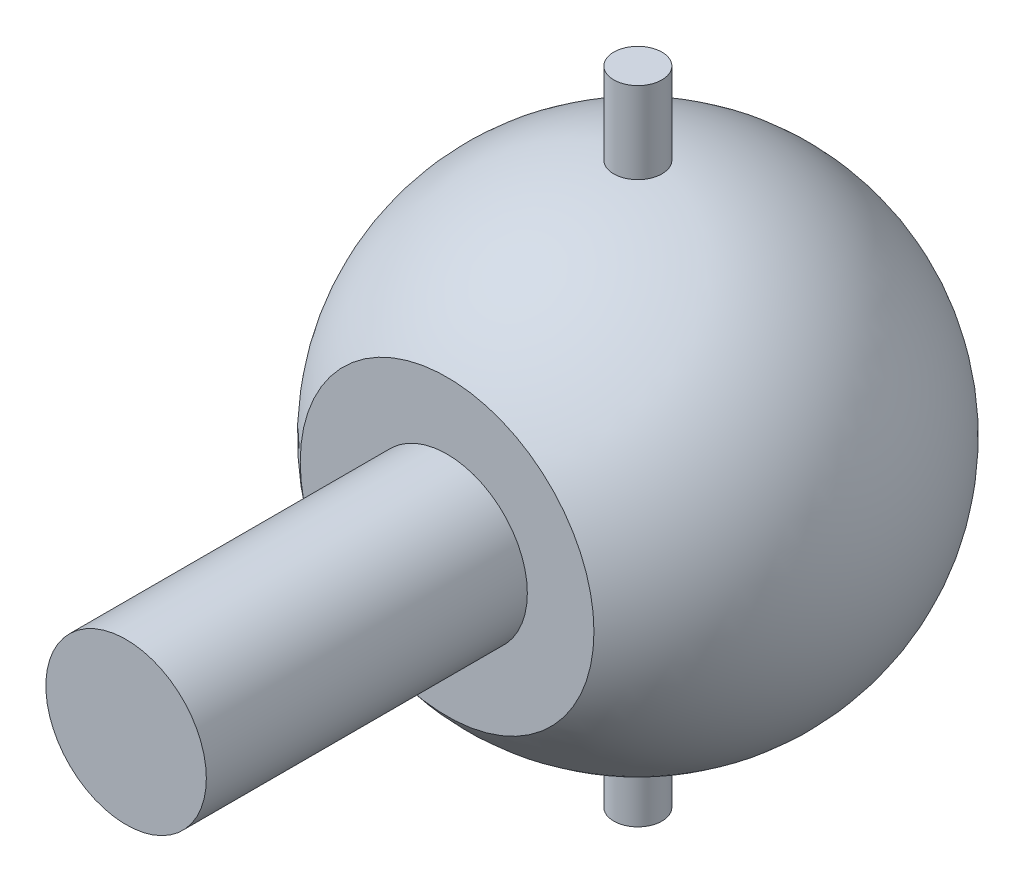
ISO-10303-21;
HEADER;
FILE_DESCRIPTION(('STEP AP214'),'2;1');
FILE_NAME('part.step','',(''),(''),'','','');
FILE_SCHEMA(('AUTOMOTIVE_DESIGN { 1 0 10303 214 1 1 1 1 }'));
ENDSEC;
DATA;
#1=APPLICATION_CONTEXT('core data for automotive mechanical design processes');
#2=APPLICATION_PROTOCOL_DEFINITION('international standard','automotive_design',2000,#1);
#3=PRODUCT_CONTEXT('',#1,'mechanical');
#4=PRODUCT('Part','Part','',(#3));
#5=PRODUCT_RELATED_PRODUCT_CATEGORY('part','',(#4));
#6=PRODUCT_DEFINITION_FORMATION('','',#4);
#7=PRODUCT_DEFINITION_CONTEXT('part definition',#1,'design');
#8=PRODUCT_DEFINITION('design','',#6,#7);
#9=PRODUCT_DEFINITION_SHAPE('','',#8);
#10=(LENGTH_UNIT() NAMED_UNIT(*) SI_UNIT(.MILLI.,.METRE.));
#11=(NAMED_UNIT(*) PLANE_ANGLE_UNIT() SI_UNIT($,.RADIAN.));
#12=(NAMED_UNIT(*) SI_UNIT($,.STERADIAN.) SOLID_ANGLE_UNIT());
#13=UNCERTAINTY_MEASURE_WITH_UNIT(LENGTH_MEASURE(1.E-05),#10,'distance_accuracy_value','');
#14=(GEOMETRIC_REPRESENTATION_CONTEXT(3) GLOBAL_UNCERTAINTY_ASSIGNED_CONTEXT((#13)) GLOBAL_UNIT_ASSIGNED_CONTEXT((#10,
#11,#12)) REPRESENTATION_CONTEXT('',''));
#15=CARTESIAN_POINT('',(0.,0.,0.));
#16=DIRECTION('',(0.,0.,1.));
#17=DIRECTION('',(1.,0.,0.));
#18=AXIS2_PLACEMENT_3D('',#15,#16,#17);
#19=CARTESIAN_POINT('',(15.,-9.1508281461021,11.8853836387601));
#20=DIRECTION('',(0.,0.,1.));
#21=DIRECTION('',(1.,0.,0.));
#22=AXIS2_PLACEMENT_3D('',#19,#20,#21);
#23=PLANE('',#22);
#24=CARTESIAN_POINT('',(0.,0.,11.8853836387601));
#25=DIRECTION('',(0.,0.,1.));
#26=DIRECTION('',(1.,0.,0.));
#27=AXIS2_PLACEMENT_3D('',#24,#25,#26);
#28=CIRCLE('',#27,9.15082814610209);
#29=CARTESIAN_POINT('',(9.15082814610209,0.,11.8853836387601));
#30=VERTEX_POINT('',#29);
#31=EDGE_CURVE('E10',#30,#30,#28,.T.);
#32=ORIENTED_EDGE('',*,*,#31,.T.);
#33=EDGE_LOOP('',(#32));
#34=FACE_BOUND('',#33,.T.);
#35=CARTESIAN_POINT('',(0.,0.,11.8853836387601));
#36=DIRECTION('',(0.,0.,1.));
#37=DIRECTION('',(1.,0.,0.));
#38=AXIS2_PLACEMENT_3D('',#35,#36,#37);
#39=CIRCLE('',#38,5.);
#40=CARTESIAN_POINT('',(5.,0.,11.8853836387601));
#41=VERTEX_POINT('',#40);
#42=EDGE_CURVE('E58',#41,#41,#39,.T.);
#43=ORIENTED_EDGE('',*,*,#42,.F.);
#44=EDGE_LOOP('',(#43));
#45=FACE_BOUND('',#44,.T.);
#46=ADVANCED_FACE('F30',(#34,#45),#23,.T.);
#47=CARTESIAN_POINT('',(0.,0.,0.));
#48=DIRECTION('',(0.,1.,0.));
#49=DIRECTION('',(1.,0.,0.));
#50=AXIS2_PLACEMENT_3D('',#47,#48,#49);
#51=SPHERICAL_SURFACE('',#50,15.);
#52=CARTESIAN_POINT('',(0.,14.9248115565993,0.));
#53=DIRECTION('',(0.,-1.,0.));
#54=DIRECTION('',(0.,0.,-1.));
#55=AXIS2_PLACEMENT_3D('',#52,#53,#54);
#56=CIRCLE('',#55,1.5);
#57=CARTESIAN_POINT('',(0.,14.9248115565993,-1.5));
#58=VERTEX_POINT('',#57);
#59=EDGE_CURVE('E34',#58,#58,#56,.T.);
#60=ORIENTED_EDGE('',*,*,#59,.T.);
#61=EDGE_LOOP('',(#60));
#62=FACE_BOUND('',#61,.T.);
#63=CARTESIAN_POINT('',(0.,-14.9248115565993,0.));
#64=DIRECTION('',(0.,1.,0.));
#65=DIRECTION('',(0.,0.,1.));
#66=AXIS2_PLACEMENT_3D('',#63,#64,#65);
#67=CIRCLE('',#66,1.5);
#68=CARTESIAN_POINT('',(0.,-14.9248115565993,1.5));
#69=VERTEX_POINT('',#68);
#70=EDGE_CURVE('E42',#69,#69,#67,.T.);
#71=ORIENTED_EDGE('',*,*,#70,.T.);
#72=EDGE_LOOP('',(#71));
#73=FACE_BOUND('',#72,.T.);
#74=ORIENTED_EDGE('',*,*,#31,.F.);
#75=EDGE_LOOP('',(#74));
#76=FACE_BOUND('',#75,.T.);
#77=ADVANCED_FACE('F32',(#62,#73,#76),#51,.T.);
#78=CARTESIAN_POINT('',(0.,-20.,0.));
#79=DIRECTION('',(0.,1.,0.));
#80=DIRECTION('',(0.,0.,1.));
#81=AXIS2_PLACEMENT_3D('',#78,#79,#80);
#82=PLANE('',#81);
#83=CARTESIAN_POINT('',(0.,-20.,0.));
#84=DIRECTION('',(0.,1.,0.));
#85=DIRECTION('',(0.,0.,1.));
#86=AXIS2_PLACEMENT_3D('',#83,#84,#85);
#87=CIRCLE('',#86,1.5);
#88=CARTESIAN_POINT('',(0.,-20.,1.5));
#89=VERTEX_POINT('',#88);
#90=EDGE_CURVE('E44',#89,#89,#87,.T.);
#91=ORIENTED_EDGE('',*,*,#90,.F.);
#92=EDGE_LOOP('',(#91));
#93=FACE_BOUND('',#92,.T.);
#94=ADVANCED_FACE('F70',(#93),#82,.F.);
#95=CARTESIAN_POINT('',(0.,-20.,0.));
#96=DIRECTION('',(0.,1.,0.));
#97=DIRECTION('',(0.,0.,1.));
#98=AXIS2_PLACEMENT_3D('',#95,#96,#97);
#99=CYLINDRICAL_SURFACE('',#98,1.5);
#100=ORIENTED_EDGE('',*,*,#90,.T.);
#101=EDGE_LOOP('',(#100));
#102=FACE_BOUND('',#101,.T.);
#103=ORIENTED_EDGE('',*,*,#70,.F.);
#104=EDGE_LOOP('',(#103));
#105=FACE_BOUND('',#104,.T.);
#106=ADVANCED_FACE('F77',(#102,#105),#99,.T.);
#107=CARTESIAN_POINT('',(0.,20.,0.));
#108=DIRECTION('',(0.,1.,0.));
#109=DIRECTION('',(0.,0.,1.));
#110=AXIS2_PLACEMENT_3D('',#107,#108,#109);
#111=CIRCLE('',#110,1.5);
#112=CARTESIAN_POINT('',(0.,20.,1.5));
#113=VERTEX_POINT('',#112);
#114=EDGE_CURVE('E50',#113,#113,#111,.T.);
#115=ORIENTED_EDGE('',*,*,#114,.F.);
#116=EDGE_LOOP('',(#115));
#117=FACE_BOUND('',#116,.T.);
#118=ORIENTED_EDGE('',*,*,#59,.F.);
#119=EDGE_LOOP('',(#118));
#120=FACE_BOUND('',#119,.T.);
#121=ADVANCED_FACE('F73',(#117,#120),#99,.T.);
#122=CARTESIAN_POINT('',(0.,20.,0.));
#123=DIRECTION('',(0.,1.,0.));
#124=DIRECTION('',(0.,0.,1.));
#125=AXIS2_PLACEMENT_3D('',#122,#123,#124);
#126=PLANE('',#125);
#127=ORIENTED_EDGE('',*,*,#114,.T.);
#128=EDGE_LOOP('',(#127));
#129=FACE_BOUND('',#128,.T.);
#130=ADVANCED_FACE('F76',(#129),#126,.T.);
#131=CARTESIAN_POINT('',(0.,0.,31.8853836387601));
#132=DIRECTION('',(0.,0.,-1.));
#133=DIRECTION('',(-1.,0.,0.));
#134=AXIS2_PLACEMENT_3D('',#131,#132,#133);
#135=CYLINDRICAL_SURFACE('',#134,5.);
#136=CARTESIAN_POINT('',(0.,0.,31.8853836387601));
#137=DIRECTION('',(0.,0.,1.));
#138=DIRECTION('',(1.,0.,0.));
#139=AXIS2_PLACEMENT_3D('',#136,#137,#138);
#140=CIRCLE('',#139,5.);
#141=CARTESIAN_POINT('',(5.,0.,31.8853836387601));
#142=VERTEX_POINT('',#141);
#143=EDGE_CURVE('E54',#142,#142,#140,.T.);
#144=ORIENTED_EDGE('',*,*,#143,.F.);
#145=EDGE_LOOP('',(#144));
#146=FACE_BOUND('',#145,.T.);
#147=ORIENTED_EDGE('',*,*,#42,.T.);
#148=EDGE_LOOP('',(#147));
#149=FACE_BOUND('',#148,.T.);
#150=ADVANCED_FACE('F64',(#146,#149),#135,.T.);
#151=CARTESIAN_POINT('',(0.,0.,31.8853836387601));
#152=DIRECTION('',(0.,0.,1.));
#153=DIRECTION('',(1.,0.,0.));
#154=AXIS2_PLACEMENT_3D('',#151,#152,#153);
#155=PLANE('',#154);
#156=ORIENTED_EDGE('',*,*,#143,.T.);
#157=EDGE_LOOP('',(#156));
#158=FACE_BOUND('',#157,.T.);
#159=ADVANCED_FACE('F86',(#158),#155,.T.);
#160=CLOSED_SHELL('',(#46,#77,#94,#106,#121,#130,#150,#159));
#161=MANIFOLD_SOLID_BREP('B2',#160);
#162=ADVANCED_BREP_SHAPE_REPRESENTATION('',(#18,#161),#14);
#163=SHAPE_DEFINITION_REPRESENTATION(#9,#162);
ENDSEC;
END-ISO-10303-21;
